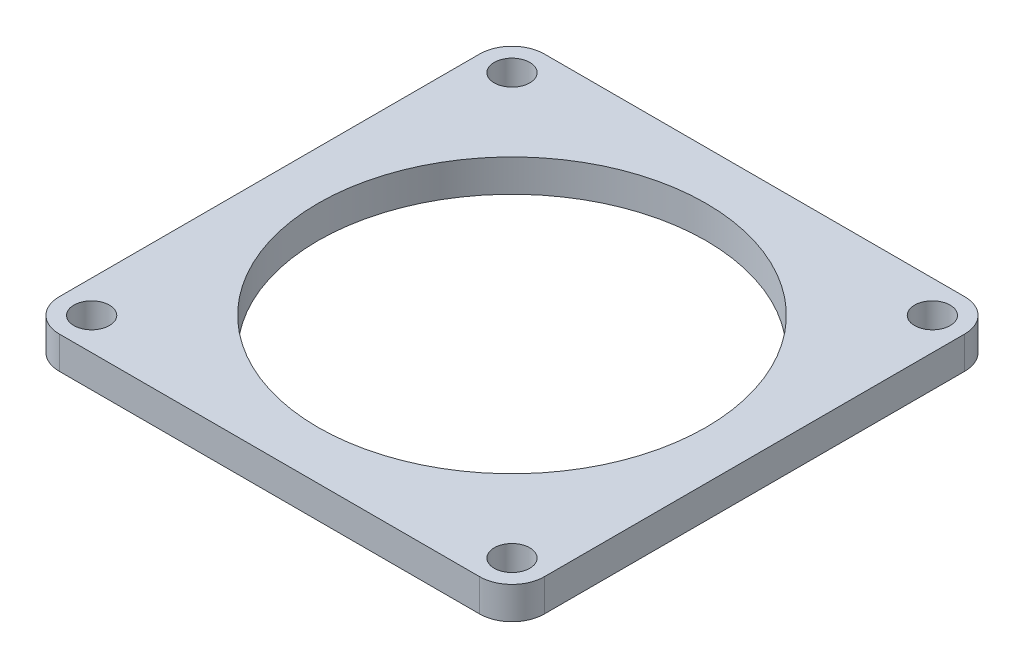
ISO-10303-21;
HEADER;
FILE_DESCRIPTION(('STEP AP214'),'2;1');
FILE_NAME('part.step','',(''),(''),'','','');
FILE_SCHEMA(('AUTOMOTIVE_DESIGN { 1 0 10303 214 1 1 1 1 }'));
ENDSEC;
DATA;
#1=APPLICATION_CONTEXT('core data for automotive mechanical design processes');
#2=APPLICATION_PROTOCOL_DEFINITION('international standard','automotive_design',2000,#1);
#3=PRODUCT_CONTEXT('',#1,'mechanical');
#4=PRODUCT('Part','Part','',(#3));
#5=PRODUCT_RELATED_PRODUCT_CATEGORY('part','',(#4));
#6=PRODUCT_DEFINITION_FORMATION('','',#4);
#7=PRODUCT_DEFINITION_CONTEXT('part definition',#1,'design');
#8=PRODUCT_DEFINITION('design','',#6,#7);
#9=PRODUCT_DEFINITION_SHAPE('','',#8);
#10=(LENGTH_UNIT() NAMED_UNIT(*) SI_UNIT(.MILLI.,.METRE.));
#11=(NAMED_UNIT(*) PLANE_ANGLE_UNIT() SI_UNIT($,.RADIAN.));
#12=(NAMED_UNIT(*) SI_UNIT($,.STERADIAN.) SOLID_ANGLE_UNIT());
#13=UNCERTAINTY_MEASURE_WITH_UNIT(LENGTH_MEASURE(1.E-05),#10,'distance_accuracy_value','');
#14=(GEOMETRIC_REPRESENTATION_CONTEXT(3) GLOBAL_UNCERTAINTY_ASSIGNED_CONTEXT((#13)) GLOBAL_UNIT_ASSIGNED_CONTEXT((#10,
#11,#12)) REPRESENTATION_CONTEXT('',''));
#15=CARTESIAN_POINT('',(0.,0.,0.));
#16=DIRECTION('',(0.,0.,1.));
#17=DIRECTION('',(1.,0.,0.));
#18=AXIS2_PLACEMENT_3D('',#15,#16,#17);
#19=CARTESIAN_POINT('',(0.,5.08,0.));
#20=DIRECTION('',(0.,-1.,0.));
#21=DIRECTION('',(0.,0.,-1.));
#22=AXIS2_PLACEMENT_3D('',#19,#20,#21);
#23=PLANE('',#22);
#24=DIRECTION('',(-1.,0.,0.));
#25=VECTOR('',#24,1.);
#26=CARTESIAN_POINT('',(-38.1,5.08,-38.1));
#27=LINE('',#26,#25);
#28=CARTESIAN_POINT('',(33.02,5.08,-38.1));
#29=VERTEX_POINT('',#28);
#30=CARTESIAN_POINT('',(-33.02,5.08,-38.1));
#31=VERTEX_POINT('',#30);
#32=EDGE_CURVE('E175',#29,#31,#27,.T.);
#33=ORIENTED_EDGE('',*,*,#32,.T.);
#34=CARTESIAN_POINT('',(-33.02,5.08,-33.02));
#35=DIRECTION('',(0.,-1.,0.));
#36=DIRECTION('',(0.,0.,-1.));
#37=AXIS2_PLACEMENT_3D('',#34,#35,#36);
#38=CIRCLE('',#37,5.08);
#39=CARTESIAN_POINT('',(-38.1,5.08,-33.02));
#40=VERTEX_POINT('',#39);
#41=EDGE_CURVE('E152',#31,#40,#38,.F.);
#42=ORIENTED_EDGE('',*,*,#41,.T.);
#43=DIRECTION('',(0.,0.,1.));
#44=VECTOR('',#43,1.);
#45=CARTESIAN_POINT('',(-38.1,5.08,38.1));
#46=LINE('',#45,#44);
#47=CARTESIAN_POINT('',(-38.1,5.08,33.02));
#48=VERTEX_POINT('',#47);
#49=EDGE_CURVE('E122',#40,#48,#46,.T.);
#50=ORIENTED_EDGE('',*,*,#49,.T.);
#51=CARTESIAN_POINT('',(-33.02,5.08,33.02));
#52=DIRECTION('',(0.,-1.,0.));
#53=DIRECTION('',(0.,0.,-1.));
#54=AXIS2_PLACEMENT_3D('',#51,#52,#53);
#55=CIRCLE('',#54,5.08);
#56=CARTESIAN_POINT('',(-33.02,5.08,38.1));
#57=VERTEX_POINT('',#56);
#58=EDGE_CURVE('E59',#48,#57,#55,.F.);
#59=ORIENTED_EDGE('',*,*,#58,.T.);
#60=DIRECTION('',(1.,0.,0.));
#61=VECTOR('',#60,1.);
#62=CARTESIAN_POINT('',(-38.1,5.08,38.1));
#63=LINE('',#62,#61);
#64=CARTESIAN_POINT('',(33.02,5.08,38.1));
#65=VERTEX_POINT('',#64);
#66=EDGE_CURVE('E138',#57,#65,#63,.T.);
#67=ORIENTED_EDGE('',*,*,#66,.T.);
#68=CARTESIAN_POINT('',(33.02,5.08,33.02));
#69=DIRECTION('',(0.,-1.,0.));
#70=DIRECTION('',(0.,0.,-1.));
#71=AXIS2_PLACEMENT_3D('',#68,#69,#70);
#72=CIRCLE('',#71,5.08);
#73=CARTESIAN_POINT('',(38.1,5.08,33.02));
#74=VERTEX_POINT('',#73);
#75=EDGE_CURVE('E147',#65,#74,#72,.F.);
#76=ORIENTED_EDGE('',*,*,#75,.T.);
#77=DIRECTION('',(0.,0.,-1.));
#78=VECTOR('',#77,1.);
#79=CARTESIAN_POINT('',(38.1,5.08,38.1));
#80=LINE('',#79,#78);
#81=CARTESIAN_POINT('',(38.1,5.08,-33.02));
#82=VERTEX_POINT('',#81);
#83=EDGE_CURVE('E132',#74,#82,#80,.T.);
#84=ORIENTED_EDGE('',*,*,#83,.T.);
#85=CARTESIAN_POINT('',(33.02,5.08,-33.02));
#86=DIRECTION('',(0.,-1.,0.));
#87=DIRECTION('',(0.,0.,-1.));
#88=AXIS2_PLACEMENT_3D('',#85,#86,#87);
#89=CIRCLE('',#88,5.08);
#90=EDGE_CURVE('E149',#82,#29,#89,.F.);
#91=ORIENTED_EDGE('',*,*,#90,.T.);
#92=EDGE_LOOP('',(#33,#42,#50,#59,#67,#76,#84,#91));
#93=FACE_BOUND('',#92,.T.);
#94=CARTESIAN_POINT('',(33.02,5.08,-33.02));
#95=DIRECTION('',(0.,1.,0.));
#96=DIRECTION('',(0.,0.,1.));
#97=AXIS2_PLACEMENT_3D('',#94,#95,#96);
#98=CIRCLE('',#97,2.794);
#99=CARTESIAN_POINT('',(33.02,5.08,-30.226));
#100=VERTEX_POINT('',#99);
#101=EDGE_CURVE('E168',#100,#100,#98,.T.);
#102=ORIENTED_EDGE('',*,*,#101,.F.);
#103=EDGE_LOOP('',(#102));
#104=FACE_BOUND('',#103,.T.);
#105=CARTESIAN_POINT('',(0.,5.08,0.));
#106=DIRECTION('',(0.,1.,0.));
#107=DIRECTION('',(0.,0.,1.));
#108=AXIS2_PLACEMENT_3D('',#105,#106,#107);
#109=CIRCLE('',#108,30.48);
#110=CARTESIAN_POINT('',(0.,5.08,30.48));
#111=VERTEX_POINT('',#110);
#112=EDGE_CURVE('E180',#111,#111,#109,.T.);
#113=ORIENTED_EDGE('',*,*,#112,.F.);
#114=EDGE_LOOP('',(#113));
#115=FACE_BOUND('',#114,.T.);
#116=CARTESIAN_POINT('',(33.02,5.08,33.02));
#117=DIRECTION('',(0.,1.,0.));
#118=DIRECTION('',(0.,0.,1.));
#119=AXIS2_PLACEMENT_3D('',#116,#117,#118);
#120=CIRCLE('',#119,2.794);
#121=CARTESIAN_POINT('',(33.02,5.08,35.814));
#122=VERTEX_POINT('',#121);
#123=EDGE_CURVE('E185',#122,#122,#120,.T.);
#124=ORIENTED_EDGE('',*,*,#123,.F.);
#125=EDGE_LOOP('',(#124));
#126=FACE_BOUND('',#125,.T.);
#127=CARTESIAN_POINT('',(-33.02,5.08,33.02));
#128=DIRECTION('',(0.,1.,0.));
#129=DIRECTION('',(0.,0.,1.));
#130=AXIS2_PLACEMENT_3D('',#127,#128,#129);
#131=CIRCLE('',#130,2.794);
#132=CARTESIAN_POINT('',(-33.02,5.08,35.814));
#133=VERTEX_POINT('',#132);
#134=EDGE_CURVE('E191',#133,#133,#131,.T.);
#135=ORIENTED_EDGE('',*,*,#134,.F.);
#136=EDGE_LOOP('',(#135));
#137=FACE_BOUND('',#136,.T.);
#138=CARTESIAN_POINT('',(-33.02,5.08,-33.02));
#139=DIRECTION('',(0.,1.,0.));
#140=DIRECTION('',(0.,0.,1.));
#141=AXIS2_PLACEMENT_3D('',#138,#139,#140);
#142=CIRCLE('',#141,2.794);
#143=CARTESIAN_POINT('',(-33.02,5.08,-30.226));
#144=VERTEX_POINT('',#143);
#145=EDGE_CURVE('E197',#144,#144,#142,.T.);
#146=ORIENTED_EDGE('',*,*,#145,.F.);
#147=EDGE_LOOP('',(#146));
#148=FACE_BOUND('',#147,.T.);
#149=ADVANCED_FACE('F37',(#93,#104,#115,#126,#137,#148),#23,.F.);
#150=CARTESIAN_POINT('',(0.,0.,0.));
#151=DIRECTION('',(0.,-1.,0.));
#152=DIRECTION('',(0.,0.,-1.));
#153=AXIS2_PLACEMENT_3D('',#150,#151,#152);
#154=PLANE('',#153);
#155=CARTESIAN_POINT('',(-33.02,0.,33.02));
#156=DIRECTION('',(0.,1.,0.));
#157=DIRECTION('',(0.,0.,1.));
#158=AXIS2_PLACEMENT_3D('',#155,#156,#157);
#159=CIRCLE('',#158,2.794);
#160=CARTESIAN_POINT('',(-33.02,0.,35.814));
#161=VERTEX_POINT('',#160);
#162=EDGE_CURVE('E194',#161,#161,#159,.T.);
#163=ORIENTED_EDGE('',*,*,#162,.T.);
#164=EDGE_LOOP('',(#163));
#165=FACE_BOUND('',#164,.T.);
#166=CARTESIAN_POINT('',(0.,0.,0.));
#167=DIRECTION('',(0.,1.,0.));
#168=DIRECTION('',(0.,0.,1.));
#169=AXIS2_PLACEMENT_3D('',#166,#167,#168);
#170=CIRCLE('',#169,30.48);
#171=CARTESIAN_POINT('',(0.,0.,30.48));
#172=VERTEX_POINT('',#171);
#173=EDGE_CURVE('E182',#172,#172,#170,.T.);
#174=ORIENTED_EDGE('',*,*,#173,.T.);
#175=EDGE_LOOP('',(#174));
#176=FACE_BOUND('',#175,.T.);
#177=DIRECTION('',(0.,0.,1.));
#178=VECTOR('',#177,1.);
#179=CARTESIAN_POINT('',(-38.1,0.,38.1));
#180=LINE('',#179,#178);
#181=CARTESIAN_POINT('',(-38.1,0.,-33.02));
#182=VERTEX_POINT('',#181);
#183=CARTESIAN_POINT('',(-38.1,0.,33.02));
#184=VERTEX_POINT('',#183);
#185=EDGE_CURVE('E120',#182,#184,#180,.T.);
#186=ORIENTED_EDGE('',*,*,#185,.F.);
#187=CARTESIAN_POINT('',(-33.02,0.,-33.02));
#188=DIRECTION('',(0.,-1.,0.));
#189=DIRECTION('',(0.,0.,-1.));
#190=AXIS2_PLACEMENT_3D('',#187,#188,#189);
#191=CIRCLE('',#190,5.08);
#192=CARTESIAN_POINT('',(-33.02,0.,-38.1));
#193=VERTEX_POINT('',#192);
#194=EDGE_CURVE('E103',#182,#193,#191,.T.);
#195=ORIENTED_EDGE('',*,*,#194,.T.);
#196=DIRECTION('',(-1.,0.,0.));
#197=VECTOR('',#196,1.);
#198=CARTESIAN_POINT('',(-38.1,0.,-38.1));
#199=LINE('',#198,#197);
#200=CARTESIAN_POINT('',(33.02,0.,-38.1));
#201=VERTEX_POINT('',#200);
#202=EDGE_CURVE('E130',#201,#193,#199,.T.);
#203=ORIENTED_EDGE('',*,*,#202,.F.);
#204=CARTESIAN_POINT('',(33.02,0.,-33.02));
#205=DIRECTION('',(0.,-1.,0.));
#206=DIRECTION('',(0.,0.,-1.));
#207=AXIS2_PLACEMENT_3D('',#204,#205,#206);
#208=CIRCLE('',#207,5.08);
#209=CARTESIAN_POINT('',(38.1,0.,-33.02));
#210=VERTEX_POINT('',#209);
#211=EDGE_CURVE('E141',#201,#210,#208,.T.);
#212=ORIENTED_EDGE('',*,*,#211,.T.);
#213=DIRECTION('',(0.,0.,-1.));
#214=VECTOR('',#213,1.);
#215=CARTESIAN_POINT('',(38.1,0.,38.1));
#216=LINE('',#215,#214);
#217=CARTESIAN_POINT('',(38.1,0.,33.02));
#218=VERTEX_POINT('',#217);
#219=EDGE_CURVE('E134',#218,#210,#216,.T.);
#220=ORIENTED_EDGE('',*,*,#219,.F.);
#221=CARTESIAN_POINT('',(33.02,0.,33.02));
#222=DIRECTION('',(0.,-1.,0.));
#223=DIRECTION('',(0.,0.,-1.));
#224=AXIS2_PLACEMENT_3D('',#221,#222,#223);
#225=CIRCLE('',#224,5.08);
#226=CARTESIAN_POINT('',(33.02,0.,38.1));
#227=VERTEX_POINT('',#226);
#228=EDGE_CURVE('E123',#218,#227,#225,.T.);
#229=ORIENTED_EDGE('',*,*,#228,.T.);
#230=DIRECTION('',(1.,0.,0.));
#231=VECTOR('',#230,1.);
#232=CARTESIAN_POINT('',(-38.1,0.,38.1));
#233=LINE('',#232,#231);
#234=CARTESIAN_POINT('',(-33.02,0.,38.1));
#235=VERTEX_POINT('',#234);
#236=EDGE_CURVE('E129',#235,#227,#233,.T.);
#237=ORIENTED_EDGE('',*,*,#236,.F.);
#238=CARTESIAN_POINT('',(-33.02,0.,33.02));
#239=DIRECTION('',(0.,-1.,0.));
#240=DIRECTION('',(0.,0.,-1.));
#241=AXIS2_PLACEMENT_3D('',#238,#239,#240);
#242=CIRCLE('',#241,5.08);
#243=EDGE_CURVE('E114',#235,#184,#242,.T.);
#244=ORIENTED_EDGE('',*,*,#243,.T.);
#245=EDGE_LOOP('',(#186,#195,#203,#212,#220,#229,#237,#244));
#246=FACE_BOUND('',#245,.T.);
#247=CARTESIAN_POINT('',(33.02,0.,-33.02));
#248=DIRECTION('',(0.,1.,0.));
#249=DIRECTION('',(0.,0.,1.));
#250=AXIS2_PLACEMENT_3D('',#247,#248,#249);
#251=CIRCLE('',#250,2.794);
#252=CARTESIAN_POINT('',(33.02,0.,-30.226));
#253=VERTEX_POINT('',#252);
#254=EDGE_CURVE('E170',#253,#253,#251,.T.);
#255=ORIENTED_EDGE('',*,*,#254,.T.);
#256=EDGE_LOOP('',(#255));
#257=FACE_BOUND('',#256,.T.);
#258=CARTESIAN_POINT('',(33.02,0.,33.02));
#259=DIRECTION('',(0.,1.,0.));
#260=DIRECTION('',(0.,0.,1.));
#261=AXIS2_PLACEMENT_3D('',#258,#259,#260);
#262=CIRCLE('',#261,2.794);
#263=CARTESIAN_POINT('',(33.02,0.,35.814));
#264=VERTEX_POINT('',#263);
#265=EDGE_CURVE('E188',#264,#264,#262,.T.);
#266=ORIENTED_EDGE('',*,*,#265,.T.);
#267=EDGE_LOOP('',(#266));
#268=FACE_BOUND('',#267,.T.);
#269=CARTESIAN_POINT('',(-33.02,0.,-33.02));
#270=DIRECTION('',(0.,1.,0.));
#271=DIRECTION('',(0.,0.,1.));
#272=AXIS2_PLACEMENT_3D('',#269,#270,#271);
#273=CIRCLE('',#272,2.794);
#274=CARTESIAN_POINT('',(-33.02,0.,-30.226));
#275=VERTEX_POINT('',#274);
#276=EDGE_CURVE('E200',#275,#275,#273,.T.);
#277=ORIENTED_EDGE('',*,*,#276,.T.);
#278=EDGE_LOOP('',(#277));
#279=FACE_BOUND('',#278,.T.);
#280=ADVANCED_FACE('F126',(#165,#176,#246,#257,#268,#279),#154,.T.);
#281=CARTESIAN_POINT('',(38.1,5.08,38.1));
#282=DIRECTION('',(-1.,0.,0.));
#283=DIRECTION('',(0.,0.,1.));
#284=AXIS2_PLACEMENT_3D('',#281,#282,#283);
#285=PLANE('',#284);
#286=ORIENTED_EDGE('',*,*,#219,.T.);
#287=DIRECTION('',(0.,-1.,0.));
#288=VECTOR('',#287,1.);
#289=CARTESIAN_POINT('',(38.1,5.08,-33.02));
#290=LINE('',#289,#288);
#291=EDGE_CURVE('E11',#210,#82,#290,.F.);
#292=ORIENTED_EDGE('',*,*,#291,.T.);
#293=ORIENTED_EDGE('',*,*,#83,.F.);
#294=DIRECTION('',(0.,-1.,0.));
#295=VECTOR('',#294,1.);
#296=CARTESIAN_POINT('',(38.1,5.08,33.02));
#297=LINE('',#296,#295);
#298=EDGE_CURVE('E45',#74,#218,#297,.T.);
#299=ORIENTED_EDGE('',*,*,#298,.T.);
#300=EDGE_LOOP('',(#286,#292,#293,#299));
#301=FACE_BOUND('',#300,.T.);
#302=ADVANCED_FACE('F163',(#301),#285,.F.);
#303=CARTESIAN_POINT('',(-38.1,5.08,-38.1));
#304=DIRECTION('',(0.,0.,1.));
#305=DIRECTION('',(1.,0.,0.));
#306=AXIS2_PLACEMENT_3D('',#303,#304,#305);
#307=PLANE('',#306);
#308=ORIENTED_EDGE('',*,*,#202,.T.);
#309=DIRECTION('',(0.,-1.,0.));
#310=VECTOR('',#309,1.);
#311=CARTESIAN_POINT('',(-33.02,5.08,-38.1));
#312=LINE('',#311,#310);
#313=EDGE_CURVE('E108',#193,#31,#312,.F.);
#314=ORIENTED_EDGE('',*,*,#313,.T.);
#315=ORIENTED_EDGE('',*,*,#32,.F.);
#316=DIRECTION('',(0.,-1.,0.));
#317=VECTOR('',#316,1.);
#318=CARTESIAN_POINT('',(33.02,5.08,-38.1));
#319=LINE('',#318,#317);
#320=EDGE_CURVE('E113',#29,#201,#319,.T.);
#321=ORIENTED_EDGE('',*,*,#320,.T.);
#322=EDGE_LOOP('',(#308,#314,#315,#321));
#323=FACE_BOUND('',#322,.T.);
#324=ADVANCED_FACE('F226',(#323),#307,.F.);
#325=CARTESIAN_POINT('',(-38.1,5.08,38.1));
#326=DIRECTION('',(1.,0.,0.));
#327=DIRECTION('',(0.,0.,-1.));
#328=AXIS2_PLACEMENT_3D('',#325,#326,#327);
#329=PLANE('',#328);
#330=ORIENTED_EDGE('',*,*,#49,.F.);
#331=DIRECTION('',(0.,-1.,0.));
#332=VECTOR('',#331,1.);
#333=CARTESIAN_POINT('',(-38.1,5.08,-33.02));
#334=LINE('',#333,#332);
#335=EDGE_CURVE('E107',#40,#182,#334,.T.);
#336=ORIENTED_EDGE('',*,*,#335,.T.);
#337=ORIENTED_EDGE('',*,*,#185,.T.);
#338=DIRECTION('',(0.,-1.,0.));
#339=VECTOR('',#338,1.);
#340=CARTESIAN_POINT('',(-38.1,5.08,33.02));
#341=LINE('',#340,#339);
#342=EDGE_CURVE('E124',#184,#48,#341,.F.);
#343=ORIENTED_EDGE('',*,*,#342,.T.);
#344=EDGE_LOOP('',(#330,#336,#337,#343));
#345=FACE_BOUND('',#344,.T.);
#346=ADVANCED_FACE('F119',(#345),#329,.F.);
#347=CARTESIAN_POINT('',(-38.1,5.08,38.1));
#348=DIRECTION('',(0.,0.,-1.));
#349=DIRECTION('',(-1.,0.,0.));
#350=AXIS2_PLACEMENT_3D('',#347,#348,#349);
#351=PLANE('',#350);
#352=ORIENTED_EDGE('',*,*,#66,.F.);
#353=DIRECTION('',(0.,-1.,0.));
#354=VECTOR('',#353,1.);
#355=CARTESIAN_POINT('',(-33.02,5.08,38.1));
#356=LINE('',#355,#354);
#357=EDGE_CURVE('E155',#57,#235,#356,.T.);
#358=ORIENTED_EDGE('',*,*,#357,.T.);
#359=ORIENTED_EDGE('',*,*,#236,.T.);
#360=DIRECTION('',(0.,-1.,0.));
#361=VECTOR('',#360,1.);
#362=CARTESIAN_POINT('',(33.02,5.08,38.1));
#363=LINE('',#362,#361);
#364=EDGE_CURVE('E52',#227,#65,#363,.F.);
#365=ORIENTED_EDGE('',*,*,#364,.T.);
#366=EDGE_LOOP('',(#352,#358,#359,#365));
#367=FACE_BOUND('',#366,.T.);
#368=ADVANCED_FACE('F221',(#367),#351,.F.);
#369=CARTESIAN_POINT('',(33.02,5.08,-33.02));
#370=DIRECTION('',(0.,-1.,0.));
#371=DIRECTION('',(0.,0.,-1.));
#372=AXIS2_PLACEMENT_3D('',#369,#370,#371);
#373=CYLINDRICAL_SURFACE('',#372,2.794);
#374=ORIENTED_EDGE('',*,*,#101,.T.);
#375=EDGE_LOOP('',(#374));
#376=FACE_BOUND('',#375,.T.);
#377=ORIENTED_EDGE('',*,*,#254,.F.);
#378=EDGE_LOOP('',(#377));
#379=FACE_BOUND('',#378,.T.);
#380=ADVANCED_FACE('F218',(#376,#379),#373,.F.);
#381=CARTESIAN_POINT('',(0.,5.08,0.));
#382=DIRECTION('',(0.,-1.,0.));
#383=DIRECTION('',(0.,0.,-1.));
#384=AXIS2_PLACEMENT_3D('',#381,#382,#383);
#385=CYLINDRICAL_SURFACE('',#384,30.48);
#386=ORIENTED_EDGE('',*,*,#112,.T.);
#387=EDGE_LOOP('',(#386));
#388=FACE_BOUND('',#387,.T.);
#389=ORIENTED_EDGE('',*,*,#173,.F.);
#390=EDGE_LOOP('',(#389));
#391=FACE_BOUND('',#390,.T.);
#392=ADVANCED_FACE('F341',(#388,#391),#385,.F.);
#393=CARTESIAN_POINT('',(33.02,5.08,33.02));
#394=DIRECTION('',(0.,-1.,0.));
#395=DIRECTION('',(0.,0.,-1.));
#396=AXIS2_PLACEMENT_3D('',#393,#394,#395);
#397=CYLINDRICAL_SURFACE('',#396,2.794);
#398=ORIENTED_EDGE('',*,*,#123,.T.);
#399=EDGE_LOOP('',(#398));
#400=FACE_BOUND('',#399,.T.);
#401=ORIENTED_EDGE('',*,*,#265,.F.);
#402=EDGE_LOOP('',(#401));
#403=FACE_BOUND('',#402,.T.);
#404=ADVANCED_FACE('F330',(#400,#403),#397,.F.);
#405=CARTESIAN_POINT('',(-33.02,5.08,33.02));
#406=DIRECTION('',(0.,-1.,0.));
#407=DIRECTION('',(0.,0.,-1.));
#408=AXIS2_PLACEMENT_3D('',#405,#406,#407);
#409=CYLINDRICAL_SURFACE('',#408,2.794);
#410=ORIENTED_EDGE('',*,*,#134,.T.);
#411=EDGE_LOOP('',(#410));
#412=FACE_BOUND('',#411,.T.);
#413=ORIENTED_EDGE('',*,*,#162,.F.);
#414=EDGE_LOOP('',(#413));
#415=FACE_BOUND('',#414,.T.);
#416=ADVANCED_FACE('F320',(#412,#415),#409,.F.);
#417=CARTESIAN_POINT('',(-33.02,5.08,-33.02));
#418=DIRECTION('',(0.,-1.,0.));
#419=DIRECTION('',(0.,0.,-1.));
#420=AXIS2_PLACEMENT_3D('',#417,#418,#419);
#421=CYLINDRICAL_SURFACE('',#420,2.794);
#422=ORIENTED_EDGE('',*,*,#145,.T.);
#423=EDGE_LOOP('',(#422));
#424=FACE_BOUND('',#423,.T.);
#425=ORIENTED_EDGE('',*,*,#276,.F.);
#426=EDGE_LOOP('',(#425));
#427=FACE_BOUND('',#426,.T.);
#428=ADVANCED_FACE('F206',(#424,#427),#421,.F.);
#429=CARTESIAN_POINT('',(-33.02,5.08,-33.02));
#430=DIRECTION('',(0.,-1.,0.));
#431=DIRECTION('',(0.,0.,-1.));
#432=AXIS2_PLACEMENT_3D('',#429,#430,#431);
#433=CYLINDRICAL_SURFACE('',#432,5.08);
#434=ORIENTED_EDGE('',*,*,#41,.F.);
#435=ORIENTED_EDGE('',*,*,#313,.F.);
#436=ORIENTED_EDGE('',*,*,#194,.F.);
#437=ORIENTED_EDGE('',*,*,#335,.F.);
#438=EDGE_LOOP('',(#434,#435,#436,#437));
#439=FACE_BOUND('',#438,.T.);
#440=ADVANCED_FACE('F106',(#439),#433,.T.);
#441=CARTESIAN_POINT('',(-33.02,5.08,33.02));
#442=DIRECTION('',(0.,-1.,0.));
#443=DIRECTION('',(0.,0.,-1.));
#444=AXIS2_PLACEMENT_3D('',#441,#442,#443);
#445=CYLINDRICAL_SURFACE('',#444,5.08);
#446=ORIENTED_EDGE('',*,*,#58,.F.);
#447=ORIENTED_EDGE('',*,*,#342,.F.);
#448=ORIENTED_EDGE('',*,*,#243,.F.);
#449=ORIENTED_EDGE('',*,*,#357,.F.);
#450=EDGE_LOOP('',(#446,#447,#448,#449));
#451=FACE_BOUND('',#450,.T.);
#452=ADVANCED_FACE('F234',(#451),#445,.T.);
#453=CARTESIAN_POINT('',(33.02,5.08,-33.02));
#454=DIRECTION('',(0.,-1.,0.));
#455=DIRECTION('',(0.,0.,-1.));
#456=AXIS2_PLACEMENT_3D('',#453,#454,#455);
#457=CYLINDRICAL_SURFACE('',#456,5.08);
#458=ORIENTED_EDGE('',*,*,#90,.F.);
#459=ORIENTED_EDGE('',*,*,#291,.F.);
#460=ORIENTED_EDGE('',*,*,#211,.F.);
#461=ORIENTED_EDGE('',*,*,#320,.F.);
#462=EDGE_LOOP('',(#458,#459,#460,#461));
#463=FACE_BOUND('',#462,.T.);
#464=ADVANCED_FACE('F236',(#463),#457,.T.);
#465=CARTESIAN_POINT('',(33.02,5.08,33.02));
#466=DIRECTION('',(0.,-1.,0.));
#467=DIRECTION('',(0.,0.,-1.));
#468=AXIS2_PLACEMENT_3D('',#465,#466,#467);
#469=CYLINDRICAL_SURFACE('',#468,5.08);
#470=ORIENTED_EDGE('',*,*,#75,.F.);
#471=ORIENTED_EDGE('',*,*,#364,.F.);
#472=ORIENTED_EDGE('',*,*,#228,.F.);
#473=ORIENTED_EDGE('',*,*,#298,.F.);
#474=EDGE_LOOP('',(#470,#471,#472,#473));
#475=FACE_BOUND('',#474,.T.);
#476=ADVANCED_FACE('F39',(#475),#469,.T.);
#477=CLOSED_SHELL('',(#149,#280,#302,#324,#346,#368,#380,#392,#404,#416,#428,#440,#452,#464,#476));
#478=MANIFOLD_SOLID_BREP('B2',#477);
#479=ADVANCED_BREP_SHAPE_REPRESENTATION('',(#18,#478),#14);
#480=SHAPE_DEFINITION_REPRESENTATION(#9,#479);
ENDSEC;
END-ISO-10303-21;
